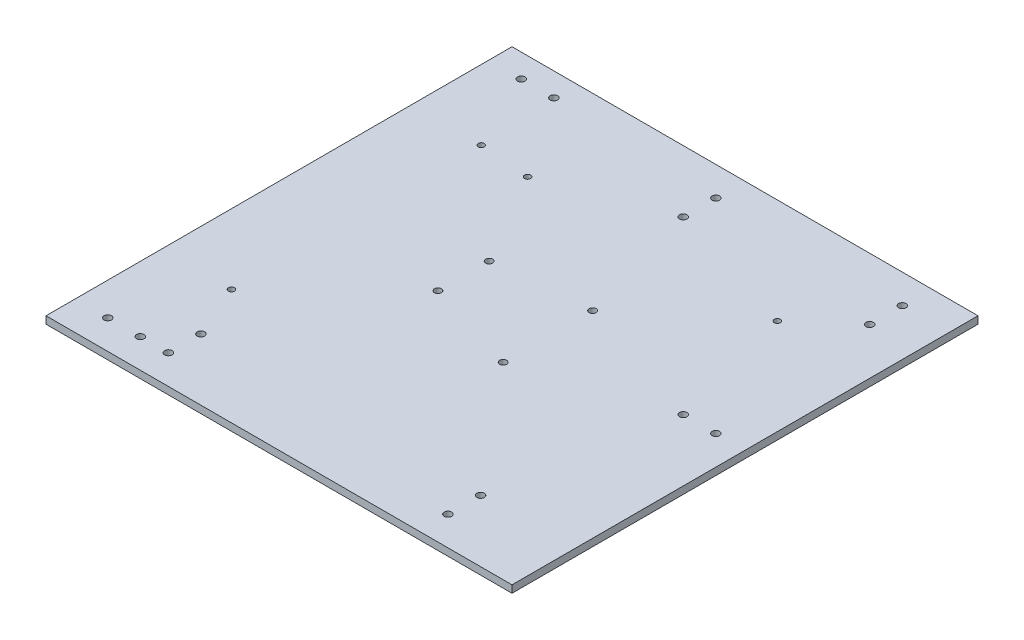
ISO-10303-21;
HEADER;
FILE_DESCRIPTION(('STEP AP214'),'2;1');
FILE_NAME('part.step','',(''),(''),'','','');
FILE_SCHEMA(('AUTOMOTIVE_DESIGN { 1 0 10303 214 1 1 1 1 }'));
ENDSEC;
DATA;
#1=APPLICATION_CONTEXT('core data for automotive mechanical design processes');
#2=APPLICATION_PROTOCOL_DEFINITION('international standard','automotive_design',2000,#1);
#3=PRODUCT_CONTEXT('',#1,'mechanical');
#4=PRODUCT('Part','Part','',(#3));
#5=PRODUCT_RELATED_PRODUCT_CATEGORY('part','',(#4));
#6=PRODUCT_DEFINITION_FORMATION('','',#4);
#7=PRODUCT_DEFINITION_CONTEXT('part definition',#1,'design');
#8=PRODUCT_DEFINITION('design','',#6,#7);
#9=PRODUCT_DEFINITION_SHAPE('','',#8);
#10=(LENGTH_UNIT() NAMED_UNIT(*) SI_UNIT(.MILLI.,.METRE.));
#11=(NAMED_UNIT(*) PLANE_ANGLE_UNIT() SI_UNIT($,.RADIAN.));
#12=(NAMED_UNIT(*) SI_UNIT($,.STERADIAN.) SOLID_ANGLE_UNIT());
#13=UNCERTAINTY_MEASURE_WITH_UNIT(LENGTH_MEASURE(1.E-05),#10,'distance_accuracy_value','');
#14=(GEOMETRIC_REPRESENTATION_CONTEXT(3) GLOBAL_UNCERTAINTY_ASSIGNED_CONTEXT((#13)) GLOBAL_UNIT_ASSIGNED_CONTEXT((#10,
#11,#12)) REPRESENTATION_CONTEXT('',''));
#15=CARTESIAN_POINT('',(0.,0.,0.));
#16=DIRECTION('',(0.,0.,1.));
#17=DIRECTION('',(1.,0.,0.));
#18=AXIS2_PLACEMENT_3D('',#15,#16,#17);
#19=CARTESIAN_POINT('',(0.,4.,0.));
#20=DIRECTION('',(0.,1.,0.));
#21=DIRECTION('',(0.,0.,1.));
#22=AXIS2_PLACEMENT_3D('',#19,#20,#21);
#23=PLANE('',#22);
#24=CARTESIAN_POINT('',(17.78,4.,-241.276758032061));
#25=DIRECTION('',(0.,1.,0.));
#26=DIRECTION('',(0.,0.,1.));
#27=AXIS2_PLACEMENT_3D('',#24,#25,#26);
#28=CIRCLE('',#27,2.032);
#29=CARTESIAN_POINT('',(17.78,4.,-239.244758032061));
#30=VERTEX_POINT('',#29);
#31=EDGE_CURVE('E290',#30,#30,#28,.T.);
#32=ORIENTED_EDGE('',*,*,#31,.F.);
#33=EDGE_LOOP('',(#32));
#34=FACE_BOUND('',#33,.T.);
#35=CARTESIAN_POINT('',(127.,4.,-238.125));
#36=DIRECTION('',(0.,1.,0.));
#37=DIRECTION('',(0.,0.,1.));
#38=AXIS2_PLACEMENT_3D('',#35,#36,#37);
#39=CIRCLE('',#38,2.032);
#40=CARTESIAN_POINT('',(127.,4.,-236.093));
#41=VERTEX_POINT('',#40);
#42=EDGE_CURVE('E274',#41,#41,#39,.T.);
#43=ORIENTED_EDGE('',*,*,#42,.F.);
#44=EDGE_LOOP('',(#43));
#45=FACE_BOUND('',#44,.T.);
#46=CARTESIAN_POINT('',(35.56,4.,-15.875));
#47=DIRECTION('',(0.,1.,0.));
#48=DIRECTION('',(0.,0.,1.));
#49=AXIS2_PLACEMENT_3D('',#46,#47,#48);
#50=CIRCLE('',#49,2.032);
#51=CARTESIAN_POINT('',(35.56,4.,-13.843));
#52=VERTEX_POINT('',#51);
#53=EDGE_CURVE('E258',#52,#52,#50,.T.);
#54=ORIENTED_EDGE('',*,*,#53,.F.);
#55=EDGE_LOOP('',(#54));
#56=FACE_BOUND('',#55,.T.);
#57=CARTESIAN_POINT('',(203.2,4.,-33.655));
#58=DIRECTION('',(0.,1.,0.));
#59=DIRECTION('',(0.,0.,1.));
#60=AXIS2_PLACEMENT_3D('',#57,#58,#59);
#61=CIRCLE('',#60,2.03200000000001);
#62=CARTESIAN_POINT('',(203.2,4.,-31.623));
#63=VERTEX_POINT('',#62);
#64=EDGE_CURVE('E242',#63,#63,#61,.T.);
#65=ORIENTED_EDGE('',*,*,#64,.F.);
#66=EDGE_LOOP('',(#65));
#67=FACE_BOUND('',#66,.T.);
#68=CARTESIAN_POINT('',(228.6,4.,-238.125));
#69=DIRECTION('',(0.,1.,0.));
#70=DIRECTION('',(0.,0.,1.));
#71=AXIS2_PLACEMENT_3D('',#68,#69,#70);
#72=CIRCLE('',#71,2.032);
#73=CARTESIAN_POINT('',(228.6,4.,-236.093));
#74=VERTEX_POINT('',#73);
#75=EDGE_CURVE('E226',#74,#74,#72,.T.);
#76=ORIENTED_EDGE('',*,*,#75,.F.);
#77=EDGE_LOOP('',(#76));
#78=FACE_BOUND('',#77,.T.);
#79=CARTESIAN_POINT('',(50.8,4.,-33.655));
#80=DIRECTION('',(0.,1.,0.));
#81=DIRECTION('',(0.,0.,1.));
#82=AXIS2_PLACEMENT_3D('',#79,#80,#81);
#83=CIRCLE('',#82,2.032);
#84=CARTESIAN_POINT('',(50.8,4.,-31.623));
#85=VERTEX_POINT('',#84);
#86=EDGE_CURVE('E210',#85,#85,#83,.T.);
#87=ORIENTED_EDGE('',*,*,#86,.F.);
#88=EDGE_LOOP('',(#87));
#89=FACE_BOUND('',#88,.T.);
#90=CARTESIAN_POINT('',(220.345,4.,-127.));
#91=DIRECTION('',(0.,1.,0.));
#92=DIRECTION('',(0.,0.,1.));
#93=AXIS2_PLACEMENT_3D('',#90,#91,#92);
#94=CIRCLE('',#93,2.032);
#95=CARTESIAN_POINT('',(220.345,4.,-124.968));
#96=VERTEX_POINT('',#95);
#97=EDGE_CURVE('E194',#96,#96,#94,.T.);
#98=ORIENTED_EDGE('',*,*,#97,.F.);
#99=EDGE_LOOP('',(#98));
#100=FACE_BOUND('',#99,.T.);
#101=CARTESIAN_POINT('',(65.659,4.,-196.85));
#102=DIRECTION('',(0.,1.,0.));
#103=DIRECTION('',(0.,0.,1.));
#104=AXIS2_PLACEMENT_3D('',#101,#102,#103);
#105=CIRCLE('',#104,1.65100000000001);
#106=CARTESIAN_POINT('',(65.659,4.,-195.199));
#107=VERTEX_POINT('',#106);
#108=EDGE_CURVE('E178',#107,#107,#105,.T.);
#109=ORIENTED_EDGE('',*,*,#108,.F.);
#110=EDGE_LOOP('',(#109));
#111=FACE_BOUND('',#110,.T.);
#112=CARTESIAN_POINT('',(38.1,4.,-62.9920000000002));
#113=DIRECTION('',(0.,1.,0.));
#114=DIRECTION('',(0.,0.,1.));
#115=AXIS2_PLACEMENT_3D('',#112,#113,#114);
#116=CIRCLE('',#115,1.651);
#117=CARTESIAN_POINT('',(38.1,4.,-61.3410000000002));
#118=VERTEX_POINT('',#117);
#119=EDGE_CURVE('E162',#118,#118,#116,.T.);
#120=ORIENTED_EDGE('',*,*,#119,.F.);
#121=EDGE_LOOP('',(#120));
#122=FACE_BOUND('',#121,.T.);
#123=CARTESIAN_POINT('',(146.558,4.,-102.616));
#124=DIRECTION('',(0.,1.,0.));
#125=DIRECTION('',(0.,0.,1.));
#126=AXIS2_PLACEMENT_3D('',#123,#124,#125);
#127=CIRCLE('',#126,1.90499999999999);
#128=CARTESIAN_POINT('',(146.558,4.,-100.711));
#129=VERTEX_POINT('',#128);
#130=EDGE_CURVE('E146',#129,#129,#127,.T.);
#131=ORIENTED_EDGE('',*,*,#130,.F.);
#132=EDGE_LOOP('',(#131));
#133=FACE_BOUND('',#132,.T.);
#134=CARTESIAN_POINT('',(94.996,4.,-146.558));
#135=DIRECTION('',(0.,1.,0.));
#136=DIRECTION('',(0.,0.,1.));
#137=AXIS2_PLACEMENT_3D('',#134,#135,#136);
#138=CIRCLE('',#137,1.905);
#139=CARTESIAN_POINT('',(94.996,4.,-144.653));
#140=VERTEX_POINT('',#139);
#141=EDGE_CURVE('E116',#140,#140,#138,.T.);
#142=ORIENTED_EDGE('',*,*,#141,.F.);
#143=EDGE_LOOP('',(#142));
#144=FACE_BOUND('',#143,.T.);
#145=DIRECTION('',(0.,0.,1.));
#146=VECTOR('',#145,1.);
#147=CARTESIAN_POINT('',(0.,4.,-254.));
#148=LINE('',#147,#146);
#149=CARTESIAN_POINT('',(0.,4.,-254.));
#150=VERTEX_POINT('',#149);
#151=CARTESIAN_POINT('',(0.,4.,0.));
#152=VERTEX_POINT('',#151);
#153=EDGE_CURVE('E96',#150,#152,#148,.T.);
#154=ORIENTED_EDGE('',*,*,#153,.T.);
#155=DIRECTION('',(1.,0.,0.));
#156=VECTOR('',#155,1.);
#157=CARTESIAN_POINT('',(0.,4.,0.));
#158=LINE('',#157,#156);
#159=CARTESIAN_POINT('',(254.,4.,0.));
#160=VERTEX_POINT('',#159);
#161=EDGE_CURVE('E91',#152,#160,#158,.T.);
#162=ORIENTED_EDGE('',*,*,#161,.T.);
#163=DIRECTION('',(0.,0.,-1.));
#164=VECTOR('',#163,1.);
#165=CARTESIAN_POINT('',(254.,4.,0.));
#166=LINE('',#165,#164);
#167=CARTESIAN_POINT('',(254.,4.,-254.));
#168=VERTEX_POINT('',#167);
#169=EDGE_CURVE('E94',#160,#168,#166,.T.);
#170=ORIENTED_EDGE('',*,*,#169,.T.);
#171=DIRECTION('',(-1.,0.,0.));
#172=VECTOR('',#171,1.);
#173=CARTESIAN_POINT('',(254.,4.,-254.));
#174=LINE('',#173,#172);
#175=EDGE_CURVE('E61',#168,#150,#174,.T.);
#176=ORIENTED_EDGE('',*,*,#175,.T.);
#177=EDGE_LOOP('',(#154,#162,#170,#176));
#178=FACE_BOUND('',#177,.T.);
#179=CARTESIAN_POINT('',(94.996,4.,-118.618));
#180=DIRECTION('',(0.,1.,0.));
#181=DIRECTION('',(0.,0.,1.));
#182=AXIS2_PLACEMENT_3D('',#179,#180,#181);
#183=CIRCLE('',#182,1.90500000000001);
#184=CARTESIAN_POINT('',(94.996,4.,-116.713));
#185=VERTEX_POINT('',#184);
#186=EDGE_CURVE('E138',#185,#185,#183,.T.);
#187=ORIENTED_EDGE('',*,*,#186,.F.);
#188=EDGE_LOOP('',(#187));
#189=FACE_BOUND('',#188,.T.);
#190=CARTESIAN_POINT('',(146.558,4.,-151.384));
#191=DIRECTION('',(0.,1.,0.));
#192=DIRECTION('',(0.,0.,1.));
#193=AXIS2_PLACEMENT_3D('',#190,#191,#192);
#194=CIRCLE('',#193,1.90499999999999);
#195=CARTESIAN_POINT('',(146.558,4.,-149.479));
#196=VERTEX_POINT('',#195);
#197=EDGE_CURVE('E154',#196,#196,#194,.T.);
#198=ORIENTED_EDGE('',*,*,#197,.F.);
#199=EDGE_LOOP('',(#198));
#200=FACE_BOUND('',#199,.T.);
#201=CARTESIAN_POINT('',(201.803,4.,-196.85));
#202=DIRECTION('',(0.,1.,0.));
#203=DIRECTION('',(0.,0.,1.));
#204=AXIS2_PLACEMENT_3D('',#201,#202,#203);
#205=CIRCLE('',#204,1.65100000000002);
#206=CARTESIAN_POINT('',(201.803,4.,-195.199));
#207=VERTEX_POINT('',#206);
#208=EDGE_CURVE('E170',#207,#207,#205,.T.);
#209=ORIENTED_EDGE('',*,*,#208,.F.);
#210=EDGE_LOOP('',(#209));
#211=FACE_BOUND('',#210,.T.);
#212=CARTESIAN_POINT('',(38.1,4.,-199.136));
#213=DIRECTION('',(0.,1.,0.));
#214=DIRECTION('',(0.,0.,1.));
#215=AXIS2_PLACEMENT_3D('',#212,#213,#214);
#216=CIRCLE('',#215,1.65100000000007);
#217=CARTESIAN_POINT('',(38.1,4.,-197.485));
#218=VERTEX_POINT('',#217);
#219=EDGE_CURVE('E186',#218,#218,#216,.T.);
#220=ORIENTED_EDGE('',*,*,#219,.F.);
#221=EDGE_LOOP('',(#220));
#222=FACE_BOUND('',#221,.T.);
#223=CARTESIAN_POINT('',(238.125,4.,-127.));
#224=DIRECTION('',(0.,1.,0.));
#225=DIRECTION('',(0.,0.,1.));
#226=AXIS2_PLACEMENT_3D('',#223,#224,#225);
#227=CIRCLE('',#226,2.032);
#228=CARTESIAN_POINT('',(238.125,4.,-124.968));
#229=VERTEX_POINT('',#228);
#230=EDGE_CURVE('E202',#229,#229,#227,.T.);
#231=ORIENTED_EDGE('',*,*,#230,.F.);
#232=EDGE_LOOP('',(#231));
#233=FACE_BOUND('',#232,.T.);
#234=CARTESIAN_POINT('',(50.8,4.,-15.875));
#235=DIRECTION('',(0.,1.,0.));
#236=DIRECTION('',(0.,0.,1.));
#237=AXIS2_PLACEMENT_3D('',#234,#235,#236);
#238=CIRCLE('',#237,2.032);
#239=CARTESIAN_POINT('',(50.8,4.,-13.843));
#240=VERTEX_POINT('',#239);
#241=EDGE_CURVE('E218',#240,#240,#238,.T.);
#242=ORIENTED_EDGE('',*,*,#241,.F.);
#243=EDGE_LOOP('',(#242));
#244=FACE_BOUND('',#243,.T.);
#245=CARTESIAN_POINT('',(228.6,4.,-220.345));
#246=DIRECTION('',(0.,1.,0.));
#247=DIRECTION('',(0.,0.,1.));
#248=AXIS2_PLACEMENT_3D('',#245,#246,#247);
#249=CIRCLE('',#248,2.032);
#250=CARTESIAN_POINT('',(228.6,4.,-218.313));
#251=VERTEX_POINT('',#250);
#252=EDGE_CURVE('E234',#251,#251,#249,.T.);
#253=ORIENTED_EDGE('',*,*,#252,.F.);
#254=EDGE_LOOP('',(#253));
#255=FACE_BOUND('',#254,.T.);
#256=CARTESIAN_POINT('',(203.2,4.,-15.875));
#257=DIRECTION('',(0.,1.,0.));
#258=DIRECTION('',(0.,0.,1.));
#259=AXIS2_PLACEMENT_3D('',#256,#257,#258);
#260=CIRCLE('',#259,2.03200000000001);
#261=CARTESIAN_POINT('',(203.2,4.,-13.843));
#262=VERTEX_POINT('',#261);
#263=EDGE_CURVE('E250',#262,#262,#260,.T.);
#264=ORIENTED_EDGE('',*,*,#263,.F.);
#265=EDGE_LOOP('',(#264));
#266=FACE_BOUND('',#265,.T.);
#267=CARTESIAN_POINT('',(17.78,4.,-15.875));
#268=DIRECTION('',(0.,1.,0.));
#269=DIRECTION('',(0.,0.,1.));
#270=AXIS2_PLACEMENT_3D('',#267,#268,#269);
#271=CIRCLE('',#270,2.032);
#272=CARTESIAN_POINT('',(17.78,4.,-13.843));
#273=VERTEX_POINT('',#272);
#274=EDGE_CURVE('E266',#273,#273,#271,.T.);
#275=ORIENTED_EDGE('',*,*,#274,.F.);
#276=EDGE_LOOP('',(#275));
#277=FACE_BOUND('',#276,.T.);
#278=CARTESIAN_POINT('',(127.,4.,-220.345));
#279=DIRECTION('',(0.,1.,0.));
#280=DIRECTION('',(0.,0.,1.));
#281=AXIS2_PLACEMENT_3D('',#278,#279,#280);
#282=CIRCLE('',#281,2.032);
#283=CARTESIAN_POINT('',(127.,4.,-218.313));
#284=VERTEX_POINT('',#283);
#285=EDGE_CURVE('E282',#284,#284,#282,.T.);
#286=ORIENTED_EDGE('',*,*,#285,.F.);
#287=EDGE_LOOP('',(#286));
#288=FACE_BOUND('',#287,.T.);
#289=CARTESIAN_POINT('',(35.56,4.,-241.276758032061));
#290=DIRECTION('',(0.,1.,0.));
#291=DIRECTION('',(0.,0.,1.));
#292=AXIS2_PLACEMENT_3D('',#289,#290,#291);
#293=CIRCLE('',#292,2.032);
#294=CARTESIAN_POINT('',(35.56,4.,-239.244758032061));
#295=VERTEX_POINT('',#294);
#296=EDGE_CURVE('E298',#295,#295,#293,.T.);
#297=ORIENTED_EDGE('',*,*,#296,.F.);
#298=EDGE_LOOP('',(#297));
#299=FACE_BOUND('',#298,.T.);
#300=ADVANCED_FACE('F43',(#34,#45,#56,#67,#78,#89,#100,#111,#122,#133,#144,#178,#189,#200,#211,
#222,#233,#244,#255,#266,#277,#288,#299),#23,.T.);
#301=CARTESIAN_POINT('',(0.,0.,0.));
#302=DIRECTION('',(0.,1.,0.));
#303=DIRECTION('',(0.,0.,1.));
#304=AXIS2_PLACEMENT_3D('',#301,#302,#303);
#305=PLANE('',#304);
#306=DIRECTION('',(0.,0.,1.));
#307=VECTOR('',#306,1.);
#308=CARTESIAN_POINT('',(0.,0.,-254.));
#309=LINE('',#308,#307);
#310=CARTESIAN_POINT('',(0.,0.,-254.));
#311=VERTEX_POINT('',#310);
#312=CARTESIAN_POINT('',(0.,0.,0.));
#313=VERTEX_POINT('',#312);
#314=EDGE_CURVE('E112',#311,#313,#309,.T.);
#315=ORIENTED_EDGE('',*,*,#314,.F.);
#316=DIRECTION('',(-1.,0.,0.));
#317=VECTOR('',#316,1.);
#318=CARTESIAN_POINT('',(254.,0.,-254.));
#319=LINE('',#318,#317);
#320=CARTESIAN_POINT('',(254.,0.,-254.));
#321=VERTEX_POINT('',#320);
#322=EDGE_CURVE('E84',#321,#311,#319,.T.);
#323=ORIENTED_EDGE('',*,*,#322,.F.);
#324=DIRECTION('',(0.,0.,-1.));
#325=VECTOR('',#324,1.);
#326=CARTESIAN_POINT('',(254.,0.,0.));
#327=LINE('',#326,#325);
#328=CARTESIAN_POINT('',(254.,0.,0.));
#329=VERTEX_POINT('',#328);
#330=EDGE_CURVE('E78',#329,#321,#327,.T.);
#331=ORIENTED_EDGE('',*,*,#330,.F.);
#332=DIRECTION('',(1.,0.,0.));
#333=VECTOR('',#332,1.);
#334=CARTESIAN_POINT('',(0.,0.,0.));
#335=LINE('',#334,#333);
#336=EDGE_CURVE('E101',#313,#329,#335,.T.);
#337=ORIENTED_EDGE('',*,*,#336,.F.);
#338=EDGE_LOOP('',(#315,#323,#331,#337));
#339=FACE_BOUND('',#338,.T.);
#340=CARTESIAN_POINT('',(94.996,0.,-146.558));
#341=DIRECTION('',(0.,1.,0.));
#342=DIRECTION('',(0.,0.,1.));
#343=AXIS2_PLACEMENT_3D('',#340,#341,#342);
#344=CIRCLE('',#343,1.905);
#345=CARTESIAN_POINT('',(94.996,0.,-144.653));
#346=VERTEX_POINT('',#345);
#347=EDGE_CURVE('E134',#346,#346,#344,.T.);
#348=ORIENTED_EDGE('',*,*,#347,.T.);
#349=EDGE_LOOP('',(#348));
#350=FACE_BOUND('',#349,.T.);
#351=CARTESIAN_POINT('',(94.996,0.,-118.618));
#352=DIRECTION('',(0.,1.,0.));
#353=DIRECTION('',(0.,0.,1.));
#354=AXIS2_PLACEMENT_3D('',#351,#352,#353);
#355=CIRCLE('',#354,1.90500000000001);
#356=CARTESIAN_POINT('',(94.996,0.,-116.713));
#357=VERTEX_POINT('',#356);
#358=EDGE_CURVE('E142',#357,#357,#355,.T.);
#359=ORIENTED_EDGE('',*,*,#358,.T.);
#360=EDGE_LOOP('',(#359));
#361=FACE_BOUND('',#360,.T.);
#362=CARTESIAN_POINT('',(146.558,0.,-102.616));
#363=DIRECTION('',(0.,1.,0.));
#364=DIRECTION('',(0.,0.,1.));
#365=AXIS2_PLACEMENT_3D('',#362,#363,#364);
#366=CIRCLE('',#365,1.90499999999999);
#367=CARTESIAN_POINT('',(146.558,0.,-100.711));
#368=VERTEX_POINT('',#367);
#369=EDGE_CURVE('E150',#368,#368,#366,.T.);
#370=ORIENTED_EDGE('',*,*,#369,.T.);
#371=EDGE_LOOP('',(#370));
#372=FACE_BOUND('',#371,.T.);
#373=CARTESIAN_POINT('',(146.558,0.,-151.384));
#374=DIRECTION('',(0.,1.,0.));
#375=DIRECTION('',(0.,0.,1.));
#376=AXIS2_PLACEMENT_3D('',#373,#374,#375);
#377=CIRCLE('',#376,1.90499999999999);
#378=CARTESIAN_POINT('',(146.558,0.,-149.479));
#379=VERTEX_POINT('',#378);
#380=EDGE_CURVE('E158',#379,#379,#377,.T.);
#381=ORIENTED_EDGE('',*,*,#380,.T.);
#382=EDGE_LOOP('',(#381));
#383=FACE_BOUND('',#382,.T.);
#384=CARTESIAN_POINT('',(38.1,0.,-62.9920000000002));
#385=DIRECTION('',(0.,1.,0.));
#386=DIRECTION('',(0.,0.,1.));
#387=AXIS2_PLACEMENT_3D('',#384,#385,#386);
#388=CIRCLE('',#387,1.651);
#389=CARTESIAN_POINT('',(38.1,0.,-61.3410000000002));
#390=VERTEX_POINT('',#389);
#391=EDGE_CURVE('E166',#390,#390,#388,.T.);
#392=ORIENTED_EDGE('',*,*,#391,.T.);
#393=EDGE_LOOP('',(#392));
#394=FACE_BOUND('',#393,.T.);
#395=CARTESIAN_POINT('',(201.803,0.,-196.85));
#396=DIRECTION('',(0.,1.,0.));
#397=DIRECTION('',(0.,0.,1.));
#398=AXIS2_PLACEMENT_3D('',#395,#396,#397);
#399=CIRCLE('',#398,1.65100000000002);
#400=CARTESIAN_POINT('',(201.803,0.,-195.199));
#401=VERTEX_POINT('',#400);
#402=EDGE_CURVE('E174',#401,#401,#399,.T.);
#403=ORIENTED_EDGE('',*,*,#402,.T.);
#404=EDGE_LOOP('',(#403));
#405=FACE_BOUND('',#404,.T.);
#406=CARTESIAN_POINT('',(65.659,0.,-196.85));
#407=DIRECTION('',(0.,1.,0.));
#408=DIRECTION('',(0.,0.,1.));
#409=AXIS2_PLACEMENT_3D('',#406,#407,#408);
#410=CIRCLE('',#409,1.65100000000001);
#411=CARTESIAN_POINT('',(65.659,0.,-195.199));
#412=VERTEX_POINT('',#411);
#413=EDGE_CURVE('E182',#412,#412,#410,.T.);
#414=ORIENTED_EDGE('',*,*,#413,.T.);
#415=EDGE_LOOP('',(#414));
#416=FACE_BOUND('',#415,.T.);
#417=CARTESIAN_POINT('',(38.1,0.,-199.136));
#418=DIRECTION('',(0.,1.,0.));
#419=DIRECTION('',(0.,0.,1.));
#420=AXIS2_PLACEMENT_3D('',#417,#418,#419);
#421=CIRCLE('',#420,1.65100000000007);
#422=CARTESIAN_POINT('',(38.1,0.,-197.485));
#423=VERTEX_POINT('',#422);
#424=EDGE_CURVE('E190',#423,#423,#421,.T.);
#425=ORIENTED_EDGE('',*,*,#424,.T.);
#426=EDGE_LOOP('',(#425));
#427=FACE_BOUND('',#426,.T.);
#428=CARTESIAN_POINT('',(220.345,0.,-127.));
#429=DIRECTION('',(0.,1.,0.));
#430=DIRECTION('',(0.,0.,1.));
#431=AXIS2_PLACEMENT_3D('',#428,#429,#430);
#432=CIRCLE('',#431,2.032);
#433=CARTESIAN_POINT('',(220.345,0.,-124.968));
#434=VERTEX_POINT('',#433);
#435=EDGE_CURVE('E198',#434,#434,#432,.T.);
#436=ORIENTED_EDGE('',*,*,#435,.T.);
#437=EDGE_LOOP('',(#436));
#438=FACE_BOUND('',#437,.T.);
#439=CARTESIAN_POINT('',(238.125,0.,-127.));
#440=DIRECTION('',(0.,1.,0.));
#441=DIRECTION('',(0.,0.,1.));
#442=AXIS2_PLACEMENT_3D('',#439,#440,#441);
#443=CIRCLE('',#442,2.032);
#444=CARTESIAN_POINT('',(238.125,0.,-124.968));
#445=VERTEX_POINT('',#444);
#446=EDGE_CURVE('E206',#445,#445,#443,.T.);
#447=ORIENTED_EDGE('',*,*,#446,.T.);
#448=EDGE_LOOP('',(#447));
#449=FACE_BOUND('',#448,.T.);
#450=CARTESIAN_POINT('',(50.8,0.,-33.655));
#451=DIRECTION('',(0.,1.,0.));
#452=DIRECTION('',(0.,0.,1.));
#453=AXIS2_PLACEMENT_3D('',#450,#451,#452);
#454=CIRCLE('',#453,2.032);
#455=CARTESIAN_POINT('',(50.8,0.,-31.623));
#456=VERTEX_POINT('',#455);
#457=EDGE_CURVE('E214',#456,#456,#454,.T.);
#458=ORIENTED_EDGE('',*,*,#457,.T.);
#459=EDGE_LOOP('',(#458));
#460=FACE_BOUND('',#459,.T.);
#461=CARTESIAN_POINT('',(50.8,0.,-15.875));
#462=DIRECTION('',(0.,1.,0.));
#463=DIRECTION('',(0.,0.,1.));
#464=AXIS2_PLACEMENT_3D('',#461,#462,#463);
#465=CIRCLE('',#464,2.032);
#466=CARTESIAN_POINT('',(50.8,0.,-13.843));
#467=VERTEX_POINT('',#466);
#468=EDGE_CURVE('E222',#467,#467,#465,.T.);
#469=ORIENTED_EDGE('',*,*,#468,.T.);
#470=EDGE_LOOP('',(#469));
#471=FACE_BOUND('',#470,.T.);
#472=CARTESIAN_POINT('',(228.6,0.,-238.125));
#473=DIRECTION('',(0.,1.,0.));
#474=DIRECTION('',(0.,0.,1.));
#475=AXIS2_PLACEMENT_3D('',#472,#473,#474);
#476=CIRCLE('',#475,2.032);
#477=CARTESIAN_POINT('',(228.6,0.,-236.093));
#478=VERTEX_POINT('',#477);
#479=EDGE_CURVE('E230',#478,#478,#476,.T.);
#480=ORIENTED_EDGE('',*,*,#479,.T.);
#481=EDGE_LOOP('',(#480));
#482=FACE_BOUND('',#481,.T.);
#483=CARTESIAN_POINT('',(228.6,0.,-220.345));
#484=DIRECTION('',(0.,1.,0.));
#485=DIRECTION('',(0.,0.,1.));
#486=AXIS2_PLACEMENT_3D('',#483,#484,#485);
#487=CIRCLE('',#486,2.032);
#488=CARTESIAN_POINT('',(228.6,0.,-218.313));
#489=VERTEX_POINT('',#488);
#490=EDGE_CURVE('E238',#489,#489,#487,.T.);
#491=ORIENTED_EDGE('',*,*,#490,.T.);
#492=EDGE_LOOP('',(#491));
#493=FACE_BOUND('',#492,.T.);
#494=CARTESIAN_POINT('',(203.2,0.,-33.655));
#495=DIRECTION('',(0.,1.,0.));
#496=DIRECTION('',(0.,0.,1.));
#497=AXIS2_PLACEMENT_3D('',#494,#495,#496);
#498=CIRCLE('',#497,2.03200000000001);
#499=CARTESIAN_POINT('',(203.2,0.,-31.623));
#500=VERTEX_POINT('',#499);
#501=EDGE_CURVE('E246',#500,#500,#498,.T.);
#502=ORIENTED_EDGE('',*,*,#501,.T.);
#503=EDGE_LOOP('',(#502));
#504=FACE_BOUND('',#503,.T.);
#505=CARTESIAN_POINT('',(203.2,0.,-15.875));
#506=DIRECTION('',(0.,1.,0.));
#507=DIRECTION('',(0.,0.,1.));
#508=AXIS2_PLACEMENT_3D('',#505,#506,#507);
#509=CIRCLE('',#508,2.03200000000001);
#510=CARTESIAN_POINT('',(203.2,0.,-13.843));
#511=VERTEX_POINT('',#510);
#512=EDGE_CURVE('E254',#511,#511,#509,.T.);
#513=ORIENTED_EDGE('',*,*,#512,.T.);
#514=EDGE_LOOP('',(#513));
#515=FACE_BOUND('',#514,.T.);
#516=CARTESIAN_POINT('',(35.56,0.,-15.875));
#517=DIRECTION('',(0.,1.,0.));
#518=DIRECTION('',(0.,0.,1.));
#519=AXIS2_PLACEMENT_3D('',#516,#517,#518);
#520=CIRCLE('',#519,2.032);
#521=CARTESIAN_POINT('',(35.56,0.,-13.843));
#522=VERTEX_POINT('',#521);
#523=EDGE_CURVE('E262',#522,#522,#520,.T.);
#524=ORIENTED_EDGE('',*,*,#523,.T.);
#525=EDGE_LOOP('',(#524));
#526=FACE_BOUND('',#525,.T.);
#527=CARTESIAN_POINT('',(17.78,0.,-15.875));
#528=DIRECTION('',(0.,1.,0.));
#529=DIRECTION('',(0.,0.,1.));
#530=AXIS2_PLACEMENT_3D('',#527,#528,#529);
#531=CIRCLE('',#530,2.032);
#532=CARTESIAN_POINT('',(17.78,0.,-13.843));
#533=VERTEX_POINT('',#532);
#534=EDGE_CURVE('E270',#533,#533,#531,.T.);
#535=ORIENTED_EDGE('',*,*,#534,.T.);
#536=EDGE_LOOP('',(#535));
#537=FACE_BOUND('',#536,.T.);
#538=CARTESIAN_POINT('',(127.,0.,-238.125));
#539=DIRECTION('',(0.,1.,0.));
#540=DIRECTION('',(0.,0.,1.));
#541=AXIS2_PLACEMENT_3D('',#538,#539,#540);
#542=CIRCLE('',#541,2.032);
#543=CARTESIAN_POINT('',(127.,0.,-236.093));
#544=VERTEX_POINT('',#543);
#545=EDGE_CURVE('E278',#544,#544,#542,.T.);
#546=ORIENTED_EDGE('',*,*,#545,.T.);
#547=EDGE_LOOP('',(#546));
#548=FACE_BOUND('',#547,.T.);
#549=CARTESIAN_POINT('',(127.,0.,-220.345));
#550=DIRECTION('',(0.,1.,0.));
#551=DIRECTION('',(0.,0.,1.));
#552=AXIS2_PLACEMENT_3D('',#549,#550,#551);
#553=CIRCLE('',#552,2.032);
#554=CARTESIAN_POINT('',(127.,0.,-218.313));
#555=VERTEX_POINT('',#554);
#556=EDGE_CURVE('E286',#555,#555,#553,.T.);
#557=ORIENTED_EDGE('',*,*,#556,.T.);
#558=EDGE_LOOP('',(#557));
#559=FACE_BOUND('',#558,.T.);
#560=CARTESIAN_POINT('',(17.78,0.,-241.276758032061));
#561=DIRECTION('',(0.,1.,0.));
#562=DIRECTION('',(0.,0.,1.));
#563=AXIS2_PLACEMENT_3D('',#560,#561,#562);
#564=CIRCLE('',#563,2.032);
#565=CARTESIAN_POINT('',(17.78,0.,-239.244758032061));
#566=VERTEX_POINT('',#565);
#567=EDGE_CURVE('E294',#566,#566,#564,.T.);
#568=ORIENTED_EDGE('',*,*,#567,.T.);
#569=EDGE_LOOP('',(#568));
#570=FACE_BOUND('',#569,.T.);
#571=CARTESIAN_POINT('',(35.56,0.,-241.276758032061));
#572=DIRECTION('',(0.,1.,0.));
#573=DIRECTION('',(0.,0.,1.));
#574=AXIS2_PLACEMENT_3D('',#571,#572,#573);
#575=CIRCLE('',#574,2.032);
#576=CARTESIAN_POINT('',(35.56,0.,-239.244758032061));
#577=VERTEX_POINT('',#576);
#578=EDGE_CURVE('E302',#577,#577,#575,.T.);
#579=ORIENTED_EDGE('',*,*,#578,.T.);
#580=EDGE_LOOP('',(#579));
#581=FACE_BOUND('',#580,.T.);
#582=ADVANCED_FACE('F129',(#339,#350,#361,#372,#383,#394,#405,#416,#427,#438,#449,#460,#471,
#482,#493,#504,#515,#526,#537,#548,#559,#570,#581),#305,.F.);
#583=CARTESIAN_POINT('',(0.,4.,-254.));
#584=DIRECTION('',(1.,0.,0.));
#585=DIRECTION('',(0.,0.,-1.));
#586=AXIS2_PLACEMENT_3D('',#583,#584,#585);
#587=PLANE('',#586);
#588=ORIENTED_EDGE('',*,*,#314,.T.);
#589=DIRECTION('',(0.,-1.,0.));
#590=VECTOR('',#589,1.);
#591=CARTESIAN_POINT('',(0.,4.,0.));
#592=LINE('',#591,#590);
#593=EDGE_CURVE('E11',#152,#313,#592,.T.);
#594=ORIENTED_EDGE('',*,*,#593,.F.);
#595=ORIENTED_EDGE('',*,*,#153,.F.);
#596=DIRECTION('',(0.,-1.,0.));
#597=VECTOR('',#596,1.);
#598=CARTESIAN_POINT('',(0.,4.,-254.));
#599=LINE('',#598,#597);
#600=EDGE_CURVE('E108',#150,#311,#599,.T.);
#601=ORIENTED_EDGE('',*,*,#600,.T.);
#602=EDGE_LOOP('',(#588,#594,#595,#601));
#603=FACE_BOUND('',#602,.T.);
#604=ADVANCED_FACE('F45',(#603),#587,.F.);
#605=CARTESIAN_POINT('',(0.,4.,0.));
#606=DIRECTION('',(0.,0.,-1.));
#607=DIRECTION('',(-1.,0.,0.));
#608=AXIS2_PLACEMENT_3D('',#605,#606,#607);
#609=PLANE('',#608);
#610=ORIENTED_EDGE('',*,*,#336,.T.);
#611=DIRECTION('',(0.,-1.,0.));
#612=VECTOR('',#611,1.);
#613=CARTESIAN_POINT('',(254.,4.,0.));
#614=LINE('',#613,#612);
#615=EDGE_CURVE('E53',#160,#329,#614,.T.);
#616=ORIENTED_EDGE('',*,*,#615,.F.);
#617=ORIENTED_EDGE('',*,*,#161,.F.);
#618=ORIENTED_EDGE('',*,*,#593,.T.);
#619=EDGE_LOOP('',(#610,#616,#617,#618));
#620=FACE_BOUND('',#619,.T.);
#621=ADVANCED_FACE('F100',(#620),#609,.F.);
#622=CARTESIAN_POINT('',(254.,4.,0.));
#623=DIRECTION('',(-1.,0.,0.));
#624=DIRECTION('',(0.,0.,1.));
#625=AXIS2_PLACEMENT_3D('',#622,#623,#624);
#626=PLANE('',#625);
#627=ORIENTED_EDGE('',*,*,#330,.T.);
#628=DIRECTION('',(0.,-1.,0.));
#629=VECTOR('',#628,1.);
#630=CARTESIAN_POINT('',(254.,4.,-254.));
#631=LINE('',#630,#629);
#632=EDGE_CURVE('E103',#168,#321,#631,.T.);
#633=ORIENTED_EDGE('',*,*,#632,.F.);
#634=ORIENTED_EDGE('',*,*,#169,.F.);
#635=ORIENTED_EDGE('',*,*,#615,.T.);
#636=EDGE_LOOP('',(#627,#633,#634,#635));
#637=FACE_BOUND('',#636,.T.);
#638=ADVANCED_FACE('F104',(#637),#626,.F.);
#639=CARTESIAN_POINT('',(254.,4.,-254.));
#640=DIRECTION('',(0.,0.,1.));
#641=DIRECTION('',(1.,0.,0.));
#642=AXIS2_PLACEMENT_3D('',#639,#640,#641);
#643=PLANE('',#642);
#644=ORIENTED_EDGE('',*,*,#322,.T.);
#645=ORIENTED_EDGE('',*,*,#600,.F.);
#646=ORIENTED_EDGE('',*,*,#175,.F.);
#647=ORIENTED_EDGE('',*,*,#632,.T.);
#648=EDGE_LOOP('',(#644,#645,#646,#647));
#649=FACE_BOUND('',#648,.T.);
#650=ADVANCED_FACE('F126',(#649),#643,.F.);
#651=CARTESIAN_POINT('',(94.996,4.,-146.558));
#652=DIRECTION('',(0.,-1.,0.));
#653=DIRECTION('',(0.,0.,-1.));
#654=AXIS2_PLACEMENT_3D('',#651,#652,#653);
#655=CYLINDRICAL_SURFACE('',#654,1.905);
#656=ORIENTED_EDGE('',*,*,#141,.T.);
#657=EDGE_LOOP('',(#656));
#658=FACE_BOUND('',#657,.T.);
#659=ORIENTED_EDGE('',*,*,#347,.F.);
#660=EDGE_LOOP('',(#659));
#661=FACE_BOUND('',#660,.T.);
#662=ADVANCED_FACE('F323',(#658,#661),#655,.F.);
#663=CARTESIAN_POINT('',(94.996,4.,-118.618));
#664=DIRECTION('',(0.,-1.,0.));
#665=DIRECTION('',(0.,0.,-1.));
#666=AXIS2_PLACEMENT_3D('',#663,#664,#665);
#667=CYLINDRICAL_SURFACE('',#666,1.90500000000001);
#668=ORIENTED_EDGE('',*,*,#186,.T.);
#669=EDGE_LOOP('',(#668));
#670=FACE_BOUND('',#669,.T.);
#671=ORIENTED_EDGE('',*,*,#358,.F.);
#672=EDGE_LOOP('',(#671));
#673=FACE_BOUND('',#672,.T.);
#674=ADVANCED_FACE('F377',(#670,#673),#667,.F.);
#675=CARTESIAN_POINT('',(146.558,4.,-102.616));
#676=DIRECTION('',(0.,-1.,0.));
#677=DIRECTION('',(0.,0.,-1.));
#678=AXIS2_PLACEMENT_3D('',#675,#676,#677);
#679=CYLINDRICAL_SURFACE('',#678,1.90499999999999);
#680=ORIENTED_EDGE('',*,*,#130,.T.);
#681=EDGE_LOOP('',(#680));
#682=FACE_BOUND('',#681,.T.);
#683=ORIENTED_EDGE('',*,*,#369,.F.);
#684=EDGE_LOOP('',(#683));
#685=FACE_BOUND('',#684,.T.);
#686=ADVANCED_FACE('F386',(#682,#685),#679,.F.);
#687=CARTESIAN_POINT('',(146.558,4.,-151.384));
#688=DIRECTION('',(0.,-1.,0.));
#689=DIRECTION('',(0.,0.,-1.));
#690=AXIS2_PLACEMENT_3D('',#687,#688,#689);
#691=CYLINDRICAL_SURFACE('',#690,1.90499999999999);
#692=ORIENTED_EDGE('',*,*,#197,.T.);
#693=EDGE_LOOP('',(#692));
#694=FACE_BOUND('',#693,.T.);
#695=ORIENTED_EDGE('',*,*,#380,.F.);
#696=EDGE_LOOP('',(#695));
#697=FACE_BOUND('',#696,.T.);
#698=ADVANCED_FACE('F395',(#694,#697),#691,.F.);
#699=CARTESIAN_POINT('',(38.1,4.,-62.9920000000002));
#700=DIRECTION('',(0.,-1.,0.));
#701=DIRECTION('',(0.,0.,-1.));
#702=AXIS2_PLACEMENT_3D('',#699,#700,#701);
#703=CYLINDRICAL_SURFACE('',#702,1.651);
#704=ORIENTED_EDGE('',*,*,#119,.T.);
#705=EDGE_LOOP('',(#704));
#706=FACE_BOUND('',#705,.T.);
#707=ORIENTED_EDGE('',*,*,#391,.F.);
#708=EDGE_LOOP('',(#707));
#709=FACE_BOUND('',#708,.T.);
#710=ADVANCED_FACE('F405',(#706,#709),#703,.F.);
#711=CARTESIAN_POINT('',(201.803,4.,-196.85));
#712=DIRECTION('',(0.,-1.,0.));
#713=DIRECTION('',(0.,0.,-1.));
#714=AXIS2_PLACEMENT_3D('',#711,#712,#713);
#715=CYLINDRICAL_SURFACE('',#714,1.65100000000002);
#716=ORIENTED_EDGE('',*,*,#208,.T.);
#717=EDGE_LOOP('',(#716));
#718=FACE_BOUND('',#717,.T.);
#719=ORIENTED_EDGE('',*,*,#402,.F.);
#720=EDGE_LOOP('',(#719));
#721=FACE_BOUND('',#720,.T.);
#722=ADVANCED_FACE('F415',(#718,#721),#715,.F.);
#723=CARTESIAN_POINT('',(65.659,4.,-196.85));
#724=DIRECTION('',(0.,-1.,0.));
#725=DIRECTION('',(0.,0.,-1.));
#726=AXIS2_PLACEMENT_3D('',#723,#724,#725);
#727=CYLINDRICAL_SURFACE('',#726,1.65100000000001);
#728=ORIENTED_EDGE('',*,*,#108,.T.);
#729=EDGE_LOOP('',(#728));
#730=FACE_BOUND('',#729,.T.);
#731=ORIENTED_EDGE('',*,*,#413,.F.);
#732=EDGE_LOOP('',(#731));
#733=FACE_BOUND('',#732,.T.);
#734=ADVANCED_FACE('F425',(#730,#733),#727,.F.);
#735=CARTESIAN_POINT('',(38.1,4.,-199.136));
#736=DIRECTION('',(0.,-1.,0.));
#737=DIRECTION('',(0.,0.,-1.));
#738=AXIS2_PLACEMENT_3D('',#735,#736,#737);
#739=CYLINDRICAL_SURFACE('',#738,1.65100000000007);
#740=ORIENTED_EDGE('',*,*,#219,.T.);
#741=EDGE_LOOP('',(#740));
#742=FACE_BOUND('',#741,.T.);
#743=ORIENTED_EDGE('',*,*,#424,.F.);
#744=EDGE_LOOP('',(#743));
#745=FACE_BOUND('',#744,.T.);
#746=ADVANCED_FACE('F435',(#742,#745),#739,.F.);
#747=CARTESIAN_POINT('',(220.345,4.,-127.));
#748=DIRECTION('',(0.,-1.,0.));
#749=DIRECTION('',(0.,0.,-1.));
#750=AXIS2_PLACEMENT_3D('',#747,#748,#749);
#751=CYLINDRICAL_SURFACE('',#750,2.032);
#752=ORIENTED_EDGE('',*,*,#97,.T.);
#753=EDGE_LOOP('',(#752));
#754=FACE_BOUND('',#753,.T.);
#755=ORIENTED_EDGE('',*,*,#435,.F.);
#756=EDGE_LOOP('',(#755));
#757=FACE_BOUND('',#756,.T.);
#758=ADVANCED_FACE('F445',(#754,#757),#751,.F.);
#759=CARTESIAN_POINT('',(238.125,4.,-127.));
#760=DIRECTION('',(0.,-1.,0.));
#761=DIRECTION('',(0.,0.,-1.));
#762=AXIS2_PLACEMENT_3D('',#759,#760,#761);
#763=CYLINDRICAL_SURFACE('',#762,2.032);
#764=ORIENTED_EDGE('',*,*,#230,.T.);
#765=EDGE_LOOP('',(#764));
#766=FACE_BOUND('',#765,.T.);
#767=ORIENTED_EDGE('',*,*,#446,.F.);
#768=EDGE_LOOP('',(#767));
#769=FACE_BOUND('',#768,.T.);
#770=ADVANCED_FACE('F455',(#766,#769),#763,.F.);
#771=CARTESIAN_POINT('',(50.8,4.,-33.655));
#772=DIRECTION('',(0.,-1.,0.));
#773=DIRECTION('',(0.,0.,-1.));
#774=AXIS2_PLACEMENT_3D('',#771,#772,#773);
#775=CYLINDRICAL_SURFACE('',#774,2.032);
#776=ORIENTED_EDGE('',*,*,#86,.T.);
#777=EDGE_LOOP('',(#776));
#778=FACE_BOUND('',#777,.T.);
#779=ORIENTED_EDGE('',*,*,#457,.F.);
#780=EDGE_LOOP('',(#779));
#781=FACE_BOUND('',#780,.T.);
#782=ADVANCED_FACE('F465',(#778,#781),#775,.F.);
#783=CARTESIAN_POINT('',(50.8,4.,-15.875));
#784=DIRECTION('',(0.,-1.,0.));
#785=DIRECTION('',(0.,0.,-1.));
#786=AXIS2_PLACEMENT_3D('',#783,#784,#785);
#787=CYLINDRICAL_SURFACE('',#786,2.032);
#788=ORIENTED_EDGE('',*,*,#241,.T.);
#789=EDGE_LOOP('',(#788));
#790=FACE_BOUND('',#789,.T.);
#791=ORIENTED_EDGE('',*,*,#468,.F.);
#792=EDGE_LOOP('',(#791));
#793=FACE_BOUND('',#792,.T.);
#794=ADVANCED_FACE('F475',(#790,#793),#787,.F.);
#795=CARTESIAN_POINT('',(228.6,4.,-238.125));
#796=DIRECTION('',(0.,-1.,0.));
#797=DIRECTION('',(0.,0.,-1.));
#798=AXIS2_PLACEMENT_3D('',#795,#796,#797);
#799=CYLINDRICAL_SURFACE('',#798,2.032);
#800=ORIENTED_EDGE('',*,*,#75,.T.);
#801=EDGE_LOOP('',(#800));
#802=FACE_BOUND('',#801,.T.);
#803=ORIENTED_EDGE('',*,*,#479,.F.);
#804=EDGE_LOOP('',(#803));
#805=FACE_BOUND('',#804,.T.);
#806=ADVANCED_FACE('F485',(#802,#805),#799,.F.);
#807=CARTESIAN_POINT('',(228.6,4.,-220.345));
#808=DIRECTION('',(0.,-1.,0.));
#809=DIRECTION('',(0.,0.,-1.));
#810=AXIS2_PLACEMENT_3D('',#807,#808,#809);
#811=CYLINDRICAL_SURFACE('',#810,2.032);
#812=ORIENTED_EDGE('',*,*,#252,.T.);
#813=EDGE_LOOP('',(#812));
#814=FACE_BOUND('',#813,.T.);
#815=ORIENTED_EDGE('',*,*,#490,.F.);
#816=EDGE_LOOP('',(#815));
#817=FACE_BOUND('',#816,.T.);
#818=ADVANCED_FACE('F495',(#814,#817),#811,.F.);
#819=CARTESIAN_POINT('',(203.2,4.,-33.655));
#820=DIRECTION('',(0.,-1.,0.));
#821=DIRECTION('',(0.,0.,-1.));
#822=AXIS2_PLACEMENT_3D('',#819,#820,#821);
#823=CYLINDRICAL_SURFACE('',#822,2.03200000000001);
#824=ORIENTED_EDGE('',*,*,#64,.T.);
#825=EDGE_LOOP('',(#824));
#826=FACE_BOUND('',#825,.T.);
#827=ORIENTED_EDGE('',*,*,#501,.F.);
#828=EDGE_LOOP('',(#827));
#829=FACE_BOUND('',#828,.T.);
#830=ADVANCED_FACE('F505',(#826,#829),#823,.F.);
#831=CARTESIAN_POINT('',(203.2,4.,-15.875));
#832=DIRECTION('',(0.,-1.,0.));
#833=DIRECTION('',(0.,0.,-1.));
#834=AXIS2_PLACEMENT_3D('',#831,#832,#833);
#835=CYLINDRICAL_SURFACE('',#834,2.03200000000001);
#836=ORIENTED_EDGE('',*,*,#263,.T.);
#837=EDGE_LOOP('',(#836));
#838=FACE_BOUND('',#837,.T.);
#839=ORIENTED_EDGE('',*,*,#512,.F.);
#840=EDGE_LOOP('',(#839));
#841=FACE_BOUND('',#840,.T.);
#842=ADVANCED_FACE('F515',(#838,#841),#835,.F.);
#843=CARTESIAN_POINT('',(35.56,4.,-15.875));
#844=DIRECTION('',(0.,-1.,0.));
#845=DIRECTION('',(0.,0.,-1.));
#846=AXIS2_PLACEMENT_3D('',#843,#844,#845);
#847=CYLINDRICAL_SURFACE('',#846,2.032);
#848=ORIENTED_EDGE('',*,*,#53,.T.);
#849=EDGE_LOOP('',(#848));
#850=FACE_BOUND('',#849,.T.);
#851=ORIENTED_EDGE('',*,*,#523,.F.);
#852=EDGE_LOOP('',(#851));
#853=FACE_BOUND('',#852,.T.);
#854=ADVANCED_FACE('F525',(#850,#853),#847,.F.);
#855=CARTESIAN_POINT('',(17.78,4.,-15.875));
#856=DIRECTION('',(0.,-1.,0.));
#857=DIRECTION('',(0.,0.,-1.));
#858=AXIS2_PLACEMENT_3D('',#855,#856,#857);
#859=CYLINDRICAL_SURFACE('',#858,2.032);
#860=ORIENTED_EDGE('',*,*,#274,.T.);
#861=EDGE_LOOP('',(#860));
#862=FACE_BOUND('',#861,.T.);
#863=ORIENTED_EDGE('',*,*,#534,.F.);
#864=EDGE_LOOP('',(#863));
#865=FACE_BOUND('',#864,.T.);
#866=ADVANCED_FACE('F535',(#862,#865),#859,.F.);
#867=CARTESIAN_POINT('',(127.,4.,-238.125));
#868=DIRECTION('',(0.,-1.,0.));
#869=DIRECTION('',(0.,0.,-1.));
#870=AXIS2_PLACEMENT_3D('',#867,#868,#869);
#871=CYLINDRICAL_SURFACE('',#870,2.032);
#872=ORIENTED_EDGE('',*,*,#42,.T.);
#873=EDGE_LOOP('',(#872));
#874=FACE_BOUND('',#873,.T.);
#875=ORIENTED_EDGE('',*,*,#545,.F.);
#876=EDGE_LOOP('',(#875));
#877=FACE_BOUND('',#876,.T.);
#878=ADVANCED_FACE('F545',(#874,#877),#871,.F.);
#879=CARTESIAN_POINT('',(127.,4.,-220.345));
#880=DIRECTION('',(0.,-1.,0.));
#881=DIRECTION('',(0.,0.,-1.));
#882=AXIS2_PLACEMENT_3D('',#879,#880,#881);
#883=CYLINDRICAL_SURFACE('',#882,2.032);
#884=ORIENTED_EDGE('',*,*,#285,.T.);
#885=EDGE_LOOP('',(#884));
#886=FACE_BOUND('',#885,.T.);
#887=ORIENTED_EDGE('',*,*,#556,.F.);
#888=EDGE_LOOP('',(#887));
#889=FACE_BOUND('',#888,.T.);
#890=ADVANCED_FACE('F555',(#886,#889),#883,.F.);
#891=CARTESIAN_POINT('',(17.78,4.,-241.276758032061));
#892=DIRECTION('',(0.,-1.,0.));
#893=DIRECTION('',(0.,0.,-1.));
#894=AXIS2_PLACEMENT_3D('',#891,#892,#893);
#895=CYLINDRICAL_SURFACE('',#894,2.032);
#896=ORIENTED_EDGE('',*,*,#31,.T.);
#897=EDGE_LOOP('',(#896));
#898=FACE_BOUND('',#897,.T.);
#899=ORIENTED_EDGE('',*,*,#567,.F.);
#900=EDGE_LOOP('',(#899));
#901=FACE_BOUND('',#900,.T.);
#902=ADVANCED_FACE('F565',(#898,#901),#895,.F.);
#903=CARTESIAN_POINT('',(35.56,4.,-241.276758032061));
#904=DIRECTION('',(0.,-1.,0.));
#905=DIRECTION('',(0.,0.,-1.));
#906=AXIS2_PLACEMENT_3D('',#903,#904,#905);
#907=CYLINDRICAL_SURFACE('',#906,2.032);
#908=ORIENTED_EDGE('',*,*,#296,.T.);
#909=EDGE_LOOP('',(#908));
#910=FACE_BOUND('',#909,.T.);
#911=ORIENTED_EDGE('',*,*,#578,.F.);
#912=EDGE_LOOP('',(#911));
#913=FACE_BOUND('',#912,.T.);
#914=ADVANCED_FACE('F310',(#910,#913),#907,.F.);
#915=CLOSED_SHELL('',(#300,#582,#604,#621,#638,#650,#662,#674,#686,#698,#710,#722,#734,#746,
#758,#770,#782,#794,#806,#818,#830,#842,#854,#866,#878,#890,#902,#914));
#916=MANIFOLD_SOLID_BREP('B2',#915);
#917=ADVANCED_BREP_SHAPE_REPRESENTATION('',(#18,#916),#14);
#918=SHAPE_DEFINITION_REPRESENTATION(#9,#917);
ENDSEC;
END-ISO-10303-21;
